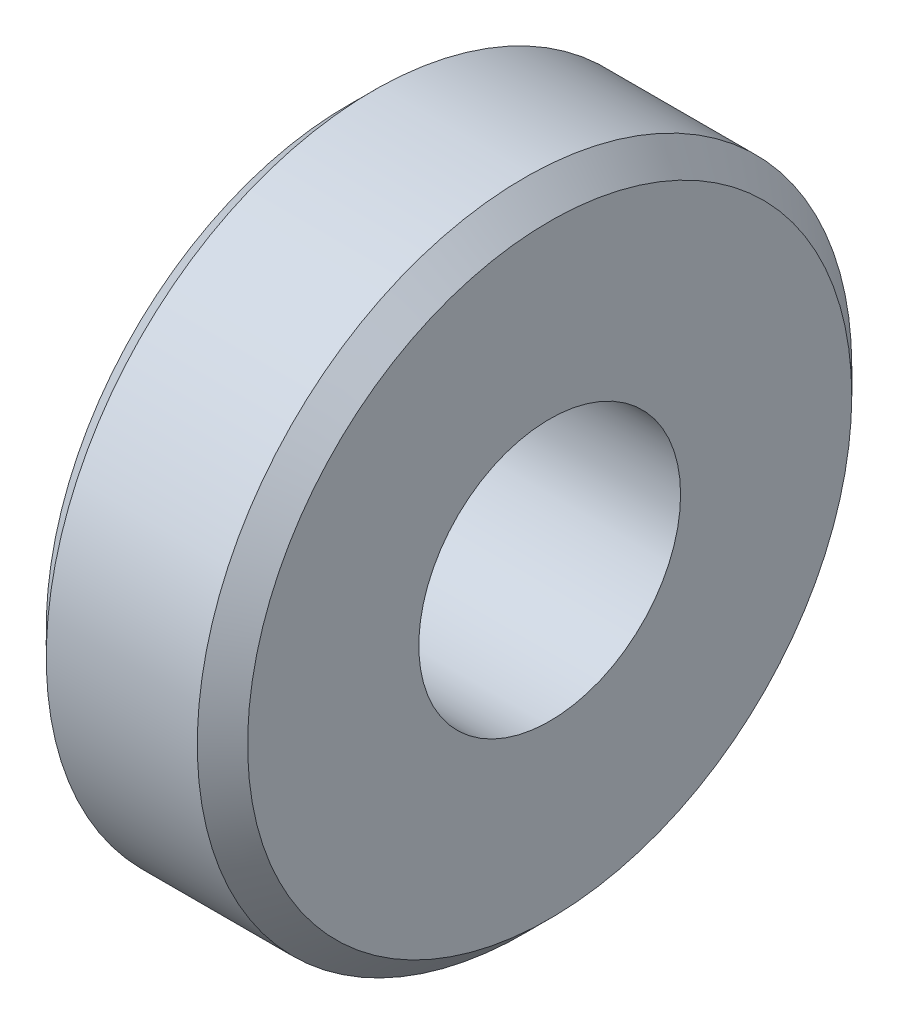
ISO-10303-21;
HEADER;
FILE_DESCRIPTION(('STEP AP214'),'2;1');
FILE_NAME('part.step','',(''),(''),'','','');
FILE_SCHEMA(('AUTOMOTIVE_DESIGN { 1 0 10303 214 1 1 1 1 }'));
ENDSEC;
DATA;
#1=APPLICATION_CONTEXT('core data for automotive mechanical design processes');
#2=APPLICATION_PROTOCOL_DEFINITION('international standard','automotive_design',2000,#1);
#3=PRODUCT_CONTEXT('',#1,'mechanical');
#4=PRODUCT('Part','Part','',(#3));
#5=PRODUCT_RELATED_PRODUCT_CATEGORY('part','',(#4));
#6=PRODUCT_DEFINITION_FORMATION('','',#4);
#7=PRODUCT_DEFINITION_CONTEXT('part definition',#1,'design');
#8=PRODUCT_DEFINITION('design','',#6,#7);
#9=PRODUCT_DEFINITION_SHAPE('','',#8);
#10=(LENGTH_UNIT() NAMED_UNIT(*) SI_UNIT(.MILLI.,.METRE.));
#11=(NAMED_UNIT(*) PLANE_ANGLE_UNIT() SI_UNIT($,.RADIAN.));
#12=(NAMED_UNIT(*) SI_UNIT($,.STERADIAN.) SOLID_ANGLE_UNIT());
#13=UNCERTAINTY_MEASURE_WITH_UNIT(LENGTH_MEASURE(1.E-05),#10,'distance_accuracy_value','');
#14=(GEOMETRIC_REPRESENTATION_CONTEXT(3) GLOBAL_UNCERTAINTY_ASSIGNED_CONTEXT((#13)) GLOBAL_UNIT_ASSIGNED_CONTEXT((#10,
#11,#12)) REPRESENTATION_CONTEXT('',''));
#15=CARTESIAN_POINT('',(0.,0.,0.));
#16=DIRECTION('',(0.,0.,1.));
#17=DIRECTION('',(1.,0.,0.));
#18=AXIS2_PLACEMENT_3D('',#15,#16,#17);
#19=CARTESIAN_POINT('',(4.,0.,0.));
#20=DIRECTION('',(1.,0.,0.));
#21=DIRECTION('',(0.,0.,-1.));
#22=AXIS2_PLACEMENT_3D('',#19,#20,#21);
#23=PLANE('',#22);
#24=CARTESIAN_POINT('',(4.,0.,0.));
#25=DIRECTION('',(1.,0.,0.));
#26=DIRECTION('',(0.,0.,-1.));
#27=AXIS2_PLACEMENT_3D('',#24,#25,#26);
#28=CIRCLE('',#27,6.);
#29=CARTESIAN_POINT('',(4.,0.,-6.));
#30=VERTEX_POINT('',#29);
#31=EDGE_CURVE('E10',#30,#30,#28,.T.);
#32=ORIENTED_EDGE('',*,*,#31,.T.);
#33=EDGE_LOOP('',(#32));
#34=FACE_BOUND('',#33,.T.);
#35=CARTESIAN_POINT('',(4.,0.,0.));
#36=DIRECTION('',(1.,0.,0.));
#37=DIRECTION('',(0.,0.,-1.));
#38=AXIS2_PLACEMENT_3D('',#35,#36,#37);
#39=CIRCLE('',#38,2.6);
#40=CARTESIAN_POINT('',(4.,0.,-2.6));
#41=VERTEX_POINT('',#40);
#42=EDGE_CURVE('E62',#41,#41,#39,.T.);
#43=ORIENTED_EDGE('',*,*,#42,.F.);
#44=EDGE_LOOP('',(#43));
#45=FACE_BOUND('',#44,.T.);
#46=ADVANCED_FACE('F41',(#34,#45),#23,.T.);
#47=CARTESIAN_POINT('',(0.,0.,0.));
#48=DIRECTION('',(1.,0.,0.));
#49=DIRECTION('',(0.,0.,-1.));
#50=AXIS2_PLACEMENT_3D('',#47,#48,#49);
#51=PLANE('',#50);
#52=CARTESIAN_POINT('',(0.,0.,0.));
#53=DIRECTION('',(1.,0.,0.));
#54=DIRECTION('',(0.,0.,-1.));
#55=AXIS2_PLACEMENT_3D('',#52,#53,#54);
#56=CIRCLE('',#55,6.);
#57=CARTESIAN_POINT('',(0.,0.,-6.));
#58=VERTEX_POINT('',#57);
#59=EDGE_CURVE('E49',#58,#58,#56,.F.);
#60=ORIENTED_EDGE('',*,*,#59,.T.);
#61=EDGE_LOOP('',(#60));
#62=FACE_BOUND('',#61,.T.);
#63=CARTESIAN_POINT('',(0.,0.,0.));
#64=DIRECTION('',(1.,0.,0.));
#65=DIRECTION('',(0.,0.,-1.));
#66=AXIS2_PLACEMENT_3D('',#63,#64,#65);
#67=CIRCLE('',#66,2.6);
#68=CARTESIAN_POINT('',(0.,0.,-2.6));
#69=VERTEX_POINT('',#68);
#70=EDGE_CURVE('E63',#69,#69,#67,.T.);
#71=ORIENTED_EDGE('',*,*,#70,.T.);
#72=EDGE_LOOP('',(#71));
#73=FACE_BOUND('',#72,.T.);
#74=ADVANCED_FACE('F73',(#62,#73),#51,.F.);
#75=CARTESIAN_POINT('',(4.,0.,0.));
#76=DIRECTION('',(-1.,0.,0.));
#77=DIRECTION('',(0.,0.,1.));
#78=AXIS2_PLACEMENT_3D('',#75,#76,#77);
#79=CYLINDRICAL_SURFACE('',#78,6.5);
#80=CARTESIAN_POINT('',(0.500000000000005,0.,0.));
#81=DIRECTION('',(1.,0.,0.));
#82=DIRECTION('',(0.,0.,-1.));
#83=AXIS2_PLACEMENT_3D('',#80,#81,#82);
#84=CIRCLE('',#83,6.5);
#85=CARTESIAN_POINT('',(0.500000000000005,0.,-6.5));
#86=VERTEX_POINT('',#85);
#87=EDGE_CURVE('E53',#86,#86,#84,.T.);
#88=ORIENTED_EDGE('',*,*,#87,.T.);
#89=EDGE_LOOP('',(#88));
#90=FACE_BOUND('',#89,.T.);
#91=CARTESIAN_POINT('',(3.5,0.,0.));
#92=DIRECTION('',(1.,0.,0.));
#93=DIRECTION('',(0.,0.,-1.));
#94=AXIS2_PLACEMENT_3D('',#91,#92,#93);
#95=CIRCLE('',#94,6.5);
#96=CARTESIAN_POINT('',(3.5,0.,-6.5));
#97=VERTEX_POINT('',#96);
#98=EDGE_CURVE('E57',#97,#97,#95,.F.);
#99=ORIENTED_EDGE('',*,*,#98,.T.);
#100=EDGE_LOOP('',(#99));
#101=FACE_BOUND('',#100,.T.);
#102=ADVANCED_FACE('F79',(#90,#101),#79,.T.);
#103=CARTESIAN_POINT('',(4.,0.,0.));
#104=DIRECTION('',(-1.,0.,0.));
#105=DIRECTION('',(0.,0.,1.));
#106=AXIS2_PLACEMENT_3D('',#103,#104,#105);
#107=CYLINDRICAL_SURFACE('',#106,2.6);
#108=ORIENTED_EDGE('',*,*,#42,.T.);
#109=EDGE_LOOP('',(#108));
#110=FACE_BOUND('',#109,.T.);
#111=ORIENTED_EDGE('',*,*,#70,.F.);
#112=EDGE_LOOP('',(#111));
#113=FACE_BOUND('',#112,.T.);
#114=ADVANCED_FACE('F69',(#110,#113),#107,.F.);
#115=CARTESIAN_POINT('',(0.500000000000005,0.,0.));
#116=DIRECTION('',(1.,0.,0.));
#117=DIRECTION('',(0.,0.,-1.));
#118=AXIS2_PLACEMENT_3D('',#115,#116,#117);
#119=CONICAL_SURFACE('',#118,6.5,0.785398163397448);
#120=ORIENTED_EDGE('',*,*,#59,.F.);
#121=EDGE_LOOP('',(#120));
#122=FACE_BOUND('',#121,.T.);
#123=ORIENTED_EDGE('',*,*,#87,.F.);
#124=EDGE_LOOP('',(#123));
#125=FACE_BOUND('',#124,.T.);
#126=ADVANCED_FACE('F86',(#122,#125),#119,.T.);
#127=CARTESIAN_POINT('',(4.,0.,0.));
#128=DIRECTION('',(-1.,0.,0.));
#129=DIRECTION('',(0.,0.,1.));
#130=AXIS2_PLACEMENT_3D('',#127,#128,#129);
#131=CONICAL_SURFACE('',#130,6.,0.785398163397448);
#132=ORIENTED_EDGE('',*,*,#98,.F.);
#133=EDGE_LOOP('',(#132));
#134=FACE_BOUND('',#133,.T.);
#135=ORIENTED_EDGE('',*,*,#31,.F.);
#136=EDGE_LOOP('',(#135));
#137=FACE_BOUND('',#136,.T.);
#138=ADVANCED_FACE('F44',(#134,#137),#131,.T.);
#139=CLOSED_SHELL('',(#46,#74,#102,#114,#126,#138));
#140=MANIFOLD_SOLID_BREP('B2',#139);
#141=ADVANCED_BREP_SHAPE_REPRESENTATION('',(#18,#140),#14);
#142=SHAPE_DEFINITION_REPRESENTATION(#9,#141);
ENDSEC;
END-ISO-10303-21;
